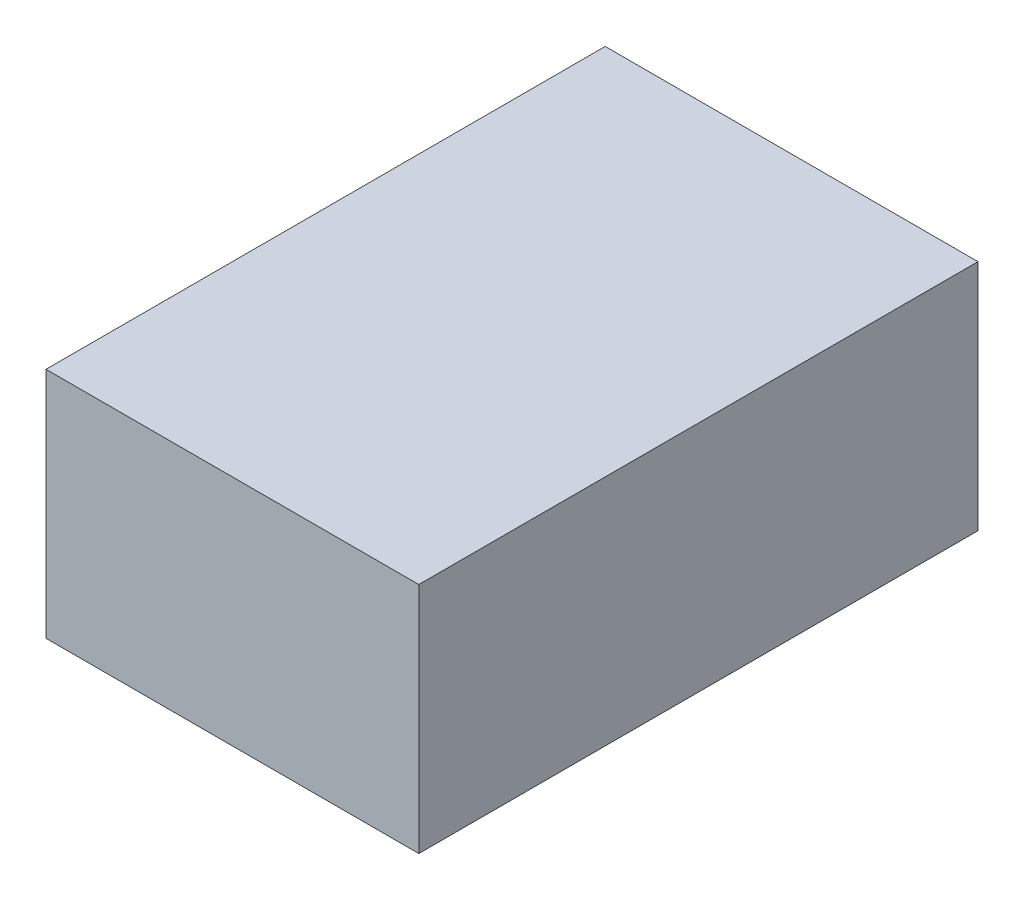
ISO-10303-21;
HEADER;
FILE_DESCRIPTION(('STEP AP214'),'2;1');
FILE_NAME('part.step','',(''),(''),'','','');
FILE_SCHEMA(('AUTOMOTIVE_DESIGN { 1 0 10303 214 1 1 1 1 }'));
ENDSEC;
DATA;
#1=APPLICATION_CONTEXT('core data for automotive mechanical design processes');
#2=APPLICATION_PROTOCOL_DEFINITION('international standard','automotive_design',2000,#1);
#3=PRODUCT_CONTEXT('',#1,'mechanical');
#4=PRODUCT('Part','Part','',(#3));
#5=PRODUCT_RELATED_PRODUCT_CATEGORY('part','',(#4));
#6=PRODUCT_DEFINITION_FORMATION('','',#4);
#7=PRODUCT_DEFINITION_CONTEXT('part definition',#1,'design');
#8=PRODUCT_DEFINITION('design','',#6,#7);
#9=PRODUCT_DEFINITION_SHAPE('','',#8);
#10=(LENGTH_UNIT() NAMED_UNIT(*) SI_UNIT(.MILLI.,.METRE.));
#11=(NAMED_UNIT(*) PLANE_ANGLE_UNIT() SI_UNIT($,.RADIAN.));
#12=(NAMED_UNIT(*) SI_UNIT($,.STERADIAN.) SOLID_ANGLE_UNIT());
#13=UNCERTAINTY_MEASURE_WITH_UNIT(LENGTH_MEASURE(1.E-05),#10,'distance_accuracy_value','');
#14=(GEOMETRIC_REPRESENTATION_CONTEXT(3) GLOBAL_UNCERTAINTY_ASSIGNED_CONTEXT((#13)) GLOBAL_UNIT_ASSIGNED_CONTEXT((#10,
#11,#12)) REPRESENTATION_CONTEXT('',''));
#15=CARTESIAN_POINT('',(0.,0.,0.));
#16=DIRECTION('',(0.,0.,1.));
#17=DIRECTION('',(1.,0.,0.));
#18=AXIS2_PLACEMENT_3D('',#15,#16,#17);
#19=CARTESIAN_POINT('',(-101.6,-63.5,304.8));
#20=DIRECTION('',(1.,0.,0.));
#21=DIRECTION('',(0.,0.,-1.));
#22=AXIS2_PLACEMENT_3D('',#19,#20,#21);
#23=PLANE('',#22);
#24=DIRECTION('',(0.,-1.,0.));
#25=VECTOR('',#24,1.);
#26=CARTESIAN_POINT('',(-101.6,-63.5,0.));
#27=LINE('',#26,#25);
#28=CARTESIAN_POINT('',(-101.6,63.5,0.));
#29=VERTEX_POINT('',#28);
#30=CARTESIAN_POINT('',(-101.6,-63.5,0.));
#31=VERTEX_POINT('',#30);
#32=EDGE_CURVE('E113',#29,#31,#27,.T.);
#33=ORIENTED_EDGE('',*,*,#32,.T.);
#34=DIRECTION('',(0.,0.,-1.));
#35=VECTOR('',#34,1.);
#36=CARTESIAN_POINT('',(-101.6,-63.5,304.8));
#37=LINE('',#36,#35);
#38=CARTESIAN_POINT('',(-101.6,-63.5,304.8));
#39=VERTEX_POINT('',#38);
#40=EDGE_CURVE('E11',#39,#31,#37,.T.);
#41=ORIENTED_EDGE('',*,*,#40,.F.);
#42=DIRECTION('',(0.,-1.,0.));
#43=VECTOR('',#42,1.);
#44=CARTESIAN_POINT('',(-101.6,-63.5,304.8));
#45=LINE('',#44,#43);
#46=CARTESIAN_POINT('',(-101.6,63.5,304.8));
#47=VERTEX_POINT('',#46);
#48=EDGE_CURVE('E97',#47,#39,#45,.T.);
#49=ORIENTED_EDGE('',*,*,#48,.F.);
#50=DIRECTION('',(0.,0.,-1.));
#51=VECTOR('',#50,1.);
#52=CARTESIAN_POINT('',(-101.6,63.5,304.8));
#53=LINE('',#52,#51);
#54=EDGE_CURVE('E109',#47,#29,#53,.T.);
#55=ORIENTED_EDGE('',*,*,#54,.T.);
#56=EDGE_LOOP('',(#33,#41,#49,#55));
#57=FACE_BOUND('',#56,.T.);
#58=ADVANCED_FACE('F45',(#57),#23,.F.);
#59=CARTESIAN_POINT('',(101.6,-63.5,304.8));
#60=DIRECTION('',(0.,1.,0.));
#61=DIRECTION('',(-1.,0.,0.));
#62=AXIS2_PLACEMENT_3D('',#59,#60,#61);
#63=PLANE('',#62);
#64=DIRECTION('',(1.,0.,0.));
#65=VECTOR('',#64,1.);
#66=CARTESIAN_POINT('',(101.6,-63.5,0.));
#67=LINE('',#66,#65);
#68=CARTESIAN_POINT('',(101.6,-63.5,0.));
#69=VERTEX_POINT('',#68);
#70=EDGE_CURVE('E102',#31,#69,#67,.T.);
#71=ORIENTED_EDGE('',*,*,#70,.T.);
#72=DIRECTION('',(0.,0.,-1.));
#73=VECTOR('',#72,1.);
#74=CARTESIAN_POINT('',(101.6,-63.5,304.8));
#75=LINE('',#74,#73);
#76=CARTESIAN_POINT('',(101.6,-63.5,304.8));
#77=VERTEX_POINT('',#76);
#78=EDGE_CURVE('E54',#77,#69,#75,.T.);
#79=ORIENTED_EDGE('',*,*,#78,.F.);
#80=DIRECTION('',(1.,0.,0.));
#81=VECTOR('',#80,1.);
#82=CARTESIAN_POINT('',(101.6,-63.5,304.8));
#83=LINE('',#82,#81);
#84=EDGE_CURVE('E92',#39,#77,#83,.T.);
#85=ORIENTED_EDGE('',*,*,#84,.F.);
#86=ORIENTED_EDGE('',*,*,#40,.T.);
#87=EDGE_LOOP('',(#71,#79,#85,#86));
#88=FACE_BOUND('',#87,.T.);
#89=ADVANCED_FACE('F101',(#88),#63,.F.);
#90=CARTESIAN_POINT('',(101.6,-63.5,304.8));
#91=DIRECTION('',(-1.,0.,0.));
#92=DIRECTION('',(0.,-1.,0.));
#93=AXIS2_PLACEMENT_3D('',#90,#91,#92);
#94=PLANE('',#93);
#95=DIRECTION('',(0.,1.,0.));
#96=VECTOR('',#95,1.);
#97=CARTESIAN_POINT('',(101.6,-63.5,0.));
#98=LINE('',#97,#96);
#99=CARTESIAN_POINT('',(101.6,63.5,0.));
#100=VERTEX_POINT('',#99);
#101=EDGE_CURVE('E79',#69,#100,#98,.T.);
#102=ORIENTED_EDGE('',*,*,#101,.T.);
#103=DIRECTION('',(0.,0.,-1.));
#104=VECTOR('',#103,1.);
#105=CARTESIAN_POINT('',(101.6,63.5,304.8));
#106=LINE('',#105,#104);
#107=CARTESIAN_POINT('',(101.6,63.5,304.8));
#108=VERTEX_POINT('',#107);
#109=EDGE_CURVE('E104',#108,#100,#106,.T.);
#110=ORIENTED_EDGE('',*,*,#109,.F.);
#111=DIRECTION('',(0.,1.,0.));
#112=VECTOR('',#111,1.);
#113=CARTESIAN_POINT('',(101.6,-63.5,304.8));
#114=LINE('',#113,#112);
#115=EDGE_CURVE('E95',#77,#108,#114,.T.);
#116=ORIENTED_EDGE('',*,*,#115,.F.);
#117=ORIENTED_EDGE('',*,*,#78,.T.);
#118=EDGE_LOOP('',(#102,#110,#116,#117));
#119=FACE_BOUND('',#118,.T.);
#120=ADVANCED_FACE('F105',(#119),#94,.F.);
#121=CARTESIAN_POINT('',(101.6,63.5,304.8));
#122=DIRECTION('',(0.,-1.,0.));
#123=DIRECTION('',(1.,0.,0.));
#124=AXIS2_PLACEMENT_3D('',#121,#122,#123);
#125=PLANE('',#124);
#126=DIRECTION('',(-1.,0.,0.));
#127=VECTOR('',#126,1.);
#128=CARTESIAN_POINT('',(101.6,63.5,0.));
#129=LINE('',#128,#127);
#130=EDGE_CURVE('E85',#100,#29,#129,.T.);
#131=ORIENTED_EDGE('',*,*,#130,.T.);
#132=ORIENTED_EDGE('',*,*,#54,.F.);
#133=DIRECTION('',(-1.,0.,0.));
#134=VECTOR('',#133,1.);
#135=CARTESIAN_POINT('',(101.6,63.5,304.8));
#136=LINE('',#135,#134);
#137=EDGE_CURVE('E62',#108,#47,#136,.T.);
#138=ORIENTED_EDGE('',*,*,#137,.F.);
#139=ORIENTED_EDGE('',*,*,#109,.T.);
#140=EDGE_LOOP('',(#131,#132,#138,#139));
#141=FACE_BOUND('',#140,.T.);
#142=ADVANCED_FACE('F126',(#141),#125,.F.);
#143=CARTESIAN_POINT('',(0.,0.,304.8));
#144=DIRECTION('',(0.,0.,1.));
#145=DIRECTION('',(1.,0.,0.));
#146=AXIS2_PLACEMENT_3D('',#143,#144,#145);
#147=PLANE('',#146);
#148=ORIENTED_EDGE('',*,*,#48,.T.);
#149=ORIENTED_EDGE('',*,*,#84,.T.);
#150=ORIENTED_EDGE('',*,*,#115,.T.);
#151=ORIENTED_EDGE('',*,*,#137,.T.);
#152=EDGE_LOOP('',(#148,#149,#150,#151));
#153=FACE_BOUND('',#152,.T.);
#154=ADVANCED_FACE('F93',(#153),#147,.T.);
#155=CARTESIAN_POINT('',(0.,0.,0.));
#156=DIRECTION('',(0.,0.,1.));
#157=DIRECTION('',(1.,0.,0.));
#158=AXIS2_PLACEMENT_3D('',#155,#156,#157);
#159=PLANE('',#158);
#160=ORIENTED_EDGE('',*,*,#32,.F.);
#161=ORIENTED_EDGE('',*,*,#130,.F.);
#162=ORIENTED_EDGE('',*,*,#101,.F.);
#163=ORIENTED_EDGE('',*,*,#70,.F.);
#164=EDGE_LOOP('',(#160,#161,#162,#163));
#165=FACE_BOUND('',#164,.T.);
#166=ADVANCED_FACE('F129',(#165),#159,.F.);
#167=CLOSED_SHELL('',(#58,#89,#120,#142,#154,#166));
#168=MANIFOLD_SOLID_BREP('B2',#167);
#169=ADVANCED_BREP_SHAPE_REPRESENTATION('',(#18,#168),#14);
#170=SHAPE_DEFINITION_REPRESENTATION(#9,#169);
ENDSEC;
END-ISO-10303-21;
